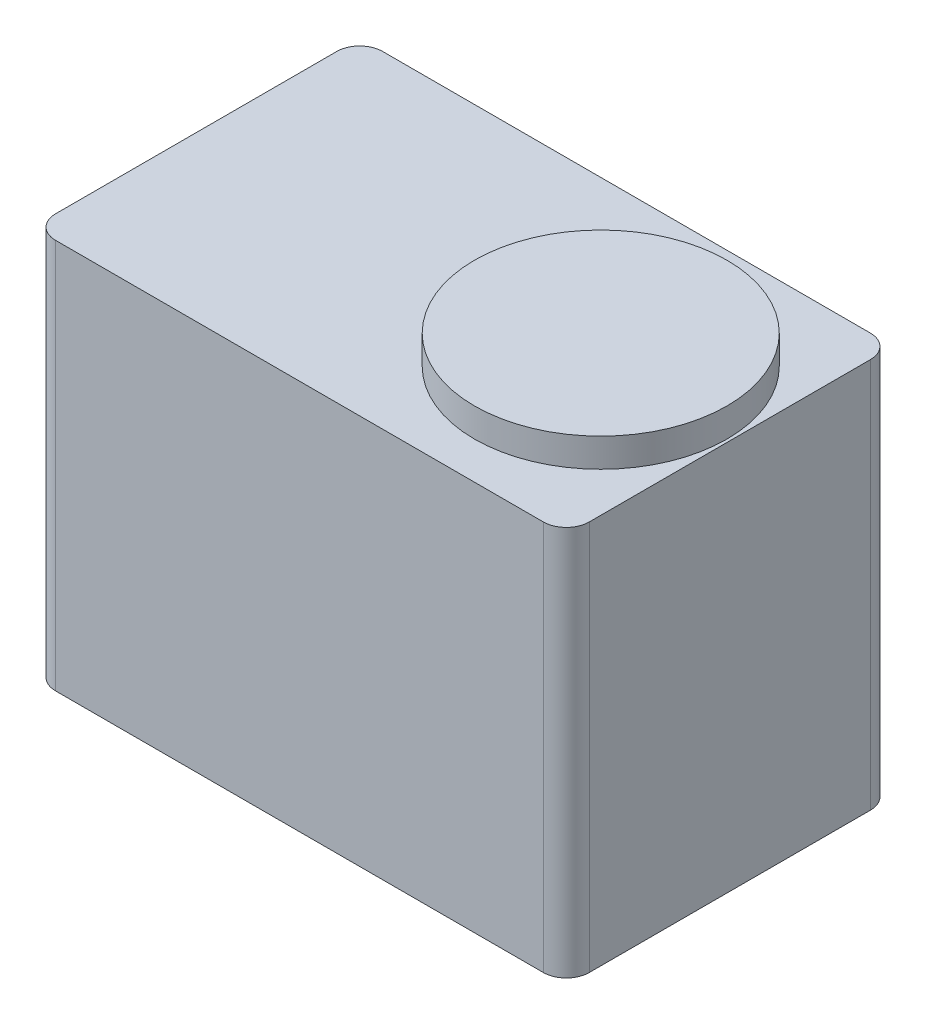
ISO-10303-21;
HEADER;
FILE_DESCRIPTION(('STEP AP214'),'2;1');
FILE_NAME('part.step','',(''),(''),'','','');
FILE_SCHEMA(('AUTOMOTIVE_DESIGN { 1 0 10303 214 1 1 1 1 }'));
ENDSEC;
DATA;
#1=APPLICATION_CONTEXT('core data for automotive mechanical design processes');
#2=APPLICATION_PROTOCOL_DEFINITION('international standard','automotive_design',2000,#1);
#3=PRODUCT_CONTEXT('',#1,'mechanical');
#4=PRODUCT('Part','Part','',(#3));
#5=PRODUCT_RELATED_PRODUCT_CATEGORY('part','',(#4));
#6=PRODUCT_DEFINITION_FORMATION('','',#4);
#7=PRODUCT_DEFINITION_CONTEXT('part definition',#1,'design');
#8=PRODUCT_DEFINITION('design','',#6,#7);
#9=PRODUCT_DEFINITION_SHAPE('','',#8);
#10=(LENGTH_UNIT() NAMED_UNIT(*) SI_UNIT(.MILLI.,.METRE.));
#11=(NAMED_UNIT(*) PLANE_ANGLE_UNIT() SI_UNIT($,.RADIAN.));
#12=(NAMED_UNIT(*) SI_UNIT($,.STERADIAN.) SOLID_ANGLE_UNIT());
#13=UNCERTAINTY_MEASURE_WITH_UNIT(LENGTH_MEASURE(1.E-05),#10,'distance_accuracy_value','');
#14=(GEOMETRIC_REPRESENTATION_CONTEXT(3) GLOBAL_UNCERTAINTY_ASSIGNED_CONTEXT((#13)) GLOBAL_UNIT_ASSIGNED_CONTEXT((#10,
#11,#12)) REPRESENTATION_CONTEXT('',''));
#15=CARTESIAN_POINT('',(0.,0.,0.));
#16=DIRECTION('',(0.,0.,1.));
#17=DIRECTION('',(1.,0.,0.));
#18=AXIS2_PLACEMENT_3D('',#15,#16,#17);
#19=CARTESIAN_POINT('',(21.25,17.,12.25));
#20=DIRECTION('',(0.,-1.,0.));
#21=DIRECTION('',(0.,0.,-1.));
#22=AXIS2_PLACEMENT_3D('',#19,#20,#21);
#23=CYLINDRICAL_SURFACE('',#22,2.);
#24=CARTESIAN_POINT('',(21.25,-17.,12.25));
#25=DIRECTION('',(0.,1.,0.));
#26=DIRECTION('',(0.,0.,1.));
#27=AXIS2_PLACEMENT_3D('',#24,#25,#26);
#28=CIRCLE('',#27,2.);
#29=CARTESIAN_POINT('',(21.25,-17.,14.25));
#30=VERTEX_POINT('',#29);
#31=CARTESIAN_POINT('',(23.25,-17.,12.25));
#32=VERTEX_POINT('',#31);
#33=EDGE_CURVE('E141',#30,#32,#28,.T.);
#34=ORIENTED_EDGE('',*,*,#33,.T.);
#35=DIRECTION('',(0.,-1.,0.));
#36=VECTOR('',#35,1.);
#37=CARTESIAN_POINT('',(23.25,17.,12.25));
#38=LINE('',#37,#36);
#39=CARTESIAN_POINT('',(23.25,17.,12.25));
#40=VERTEX_POINT('',#39);
#41=EDGE_CURVE('E46',#40,#32,#38,.T.);
#42=ORIENTED_EDGE('',*,*,#41,.F.);
#43=CARTESIAN_POINT('',(21.25,17.,12.25));
#44=DIRECTION('',(0.,1.,0.));
#45=DIRECTION('',(0.,0.,1.));
#46=AXIS2_PLACEMENT_3D('',#43,#44,#45);
#47=CIRCLE('',#46,2.);
#48=CARTESIAN_POINT('',(21.25,17.,14.25));
#49=VERTEX_POINT('',#48);
#50=EDGE_CURVE('E156',#49,#40,#47,.T.);
#51=ORIENTED_EDGE('',*,*,#50,.F.);
#52=DIRECTION('',(0.,-1.,0.));
#53=VECTOR('',#52,1.);
#54=CARTESIAN_POINT('',(21.25,17.,14.25));
#55=LINE('',#54,#53);
#56=EDGE_CURVE('E137',#49,#30,#55,.T.);
#57=ORIENTED_EDGE('',*,*,#56,.T.);
#58=EDGE_LOOP('',(#34,#42,#51,#57));
#59=FACE_BOUND('',#58,.T.);
#60=ADVANCED_FACE('F43',(#59),#23,.T.);
#61=CARTESIAN_POINT('',(23.25,17.,12.25));
#62=DIRECTION('',(-1.,0.,0.));
#63=DIRECTION('',(0.,0.,1.));
#64=AXIS2_PLACEMENT_3D('',#61,#62,#63);
#65=PLANE('',#64);
#66=DIRECTION('',(0.,0.,-1.));
#67=VECTOR('',#66,1.);
#68=CARTESIAN_POINT('',(23.25,-17.,12.25));
#69=LINE('',#68,#67);
#70=CARTESIAN_POINT('',(23.25,-17.,-12.25));
#71=VERTEX_POINT('',#70);
#72=EDGE_CURVE('E144',#32,#71,#69,.T.);
#73=ORIENTED_EDGE('',*,*,#72,.T.);
#74=DIRECTION('',(0.,-1.,0.));
#75=VECTOR('',#74,1.);
#76=CARTESIAN_POINT('',(23.25,17.,-12.25));
#77=LINE('',#76,#75);
#78=CARTESIAN_POINT('',(23.25,17.,-12.25));
#79=VERTEX_POINT('',#78);
#80=EDGE_CURVE('E165',#79,#71,#77,.T.);
#81=ORIENTED_EDGE('',*,*,#80,.F.);
#82=DIRECTION('',(0.,0.,-1.));
#83=VECTOR('',#82,1.);
#84=CARTESIAN_POINT('',(23.25,17.,12.25));
#85=LINE('',#84,#83);
#86=EDGE_CURVE('E104',#40,#79,#85,.T.);
#87=ORIENTED_EDGE('',*,*,#86,.F.);
#88=ORIENTED_EDGE('',*,*,#41,.T.);
#89=EDGE_LOOP('',(#73,#81,#87,#88));
#90=FACE_BOUND('',#89,.T.);
#91=ADVANCED_FACE('F171',(#90),#65,.F.);
#92=CARTESIAN_POINT('',(21.25,17.,-12.25));
#93=DIRECTION('',(0.,-1.,0.));
#94=DIRECTION('',(0.,0.,-1.));
#95=AXIS2_PLACEMENT_3D('',#92,#93,#94);
#96=CYLINDRICAL_SURFACE('',#95,2.);
#97=CARTESIAN_POINT('',(21.25,-17.,-12.25));
#98=DIRECTION('',(0.,1.,0.));
#99=DIRECTION('',(0.,0.,-1.));
#100=AXIS2_PLACEMENT_3D('',#97,#98,#99);
#101=CIRCLE('',#100,2.);
#102=CARTESIAN_POINT('',(21.25,-17.,-14.25));
#103=VERTEX_POINT('',#102);
#104=EDGE_CURVE('E147',#71,#103,#101,.T.);
#105=ORIENTED_EDGE('',*,*,#104,.T.);
#106=DIRECTION('',(0.,-1.,0.));
#107=VECTOR('',#106,1.);
#108=CARTESIAN_POINT('',(21.25,17.,-14.25));
#109=LINE('',#108,#107);
#110=CARTESIAN_POINT('',(21.25,17.,-14.25));
#111=VERTEX_POINT('',#110);
#112=EDGE_CURVE('E163',#111,#103,#109,.T.);
#113=ORIENTED_EDGE('',*,*,#112,.F.);
#114=CARTESIAN_POINT('',(21.25,17.,-12.25));
#115=DIRECTION('',(0.,1.,0.));
#116=DIRECTION('',(0.,0.,-1.));
#117=AXIS2_PLACEMENT_3D('',#114,#115,#116);
#118=CIRCLE('',#117,2.);
#119=EDGE_CURVE('E186',#79,#111,#118,.T.);
#120=ORIENTED_EDGE('',*,*,#119,.F.);
#121=ORIENTED_EDGE('',*,*,#80,.T.);
#122=EDGE_LOOP('',(#105,#113,#120,#121));
#123=FACE_BOUND('',#122,.T.);
#124=ADVANCED_FACE('F180',(#123),#96,.T.);
#125=CARTESIAN_POINT('',(-21.25,17.,-14.25));
#126=DIRECTION('',(0.,0.,1.));
#127=DIRECTION('',(1.,0.,0.));
#128=AXIS2_PLACEMENT_3D('',#125,#126,#127);
#129=PLANE('',#128);
#130=DIRECTION('',(-1.,0.,0.));
#131=VECTOR('',#130,1.);
#132=CARTESIAN_POINT('',(-21.25,-17.,-14.25));
#133=LINE('',#132,#131);
#134=CARTESIAN_POINT('',(-21.25,-17.,-14.25));
#135=VERTEX_POINT('',#134);
#136=EDGE_CURVE('E149',#103,#135,#133,.T.);
#137=ORIENTED_EDGE('',*,*,#136,.T.);
#138=DIRECTION('',(0.,-1.,0.));
#139=VECTOR('',#138,1.);
#140=CARTESIAN_POINT('',(-21.25,17.,-14.25));
#141=LINE('',#140,#139);
#142=CARTESIAN_POINT('',(-21.25,17.,-14.25));
#143=VERTEX_POINT('',#142);
#144=EDGE_CURVE('E160',#143,#135,#141,.T.);
#145=ORIENTED_EDGE('',*,*,#144,.F.);
#146=DIRECTION('',(-1.,0.,0.));
#147=VECTOR('',#146,1.);
#148=CARTESIAN_POINT('',(-21.25,17.,-14.25));
#149=LINE('',#148,#147);
#150=EDGE_CURVE('E185',#111,#143,#149,.T.);
#151=ORIENTED_EDGE('',*,*,#150,.F.);
#152=ORIENTED_EDGE('',*,*,#112,.T.);
#153=EDGE_LOOP('',(#137,#145,#151,#152));
#154=FACE_BOUND('',#153,.T.);
#155=ADVANCED_FACE('F183',(#154),#129,.F.);
#156=CARTESIAN_POINT('',(-21.25,17.,-12.25));
#157=DIRECTION('',(0.,-1.,0.));
#158=DIRECTION('',(0.,0.,-1.));
#159=AXIS2_PLACEMENT_3D('',#156,#157,#158);
#160=CYLINDRICAL_SURFACE('',#159,2.);
#161=CARTESIAN_POINT('',(-21.25,-17.,-12.25));
#162=DIRECTION('',(0.,1.,0.));
#163=DIRECTION('',(0.,0.,-1.));
#164=AXIS2_PLACEMENT_3D('',#161,#162,#163);
#165=CIRCLE('',#164,2.);
#166=CARTESIAN_POINT('',(-23.25,-17.,-12.25));
#167=VERTEX_POINT('',#166);
#168=EDGE_CURVE('E151',#135,#167,#165,.T.);
#169=ORIENTED_EDGE('',*,*,#168,.T.);
#170=DIRECTION('',(0.,-1.,0.));
#171=VECTOR('',#170,1.);
#172=CARTESIAN_POINT('',(-23.25,17.,-12.25));
#173=LINE('',#172,#171);
#174=CARTESIAN_POINT('',(-23.25,17.,-12.25));
#175=VERTEX_POINT('',#174);
#176=EDGE_CURVE('E132',#175,#167,#173,.T.);
#177=ORIENTED_EDGE('',*,*,#176,.F.);
#178=CARTESIAN_POINT('',(-21.25,17.,-12.25));
#179=DIRECTION('',(0.,1.,0.));
#180=DIRECTION('',(0.,0.,-1.));
#181=AXIS2_PLACEMENT_3D('',#178,#179,#180);
#182=CIRCLE('',#181,2.);
#183=EDGE_CURVE('E123',#143,#175,#182,.T.);
#184=ORIENTED_EDGE('',*,*,#183,.F.);
#185=ORIENTED_EDGE('',*,*,#144,.T.);
#186=EDGE_LOOP('',(#169,#177,#184,#185));
#187=FACE_BOUND('',#186,.T.);
#188=ADVANCED_FACE('F225',(#187),#160,.T.);
#189=CARTESIAN_POINT('',(-23.25,17.,12.25));
#190=DIRECTION('',(1.,0.,0.));
#191=DIRECTION('',(0.,0.,-1.));
#192=AXIS2_PLACEMENT_3D('',#189,#190,#191);
#193=PLANE('',#192);
#194=DIRECTION('',(0.,0.,1.));
#195=VECTOR('',#194,1.);
#196=CARTESIAN_POINT('',(-23.25,-17.,12.25));
#197=LINE('',#196,#195);
#198=CARTESIAN_POINT('',(-23.25,-17.,12.25));
#199=VERTEX_POINT('',#198);
#200=EDGE_CURVE('E131',#167,#199,#197,.T.);
#201=ORIENTED_EDGE('',*,*,#200,.T.);
#202=DIRECTION('',(0.,-1.,0.));
#203=VECTOR('',#202,1.);
#204=CARTESIAN_POINT('',(-23.25,17.,12.25));
#205=LINE('',#204,#203);
#206=CARTESIAN_POINT('',(-23.25,17.,12.25));
#207=VERTEX_POINT('',#206);
#208=EDGE_CURVE('E128',#207,#199,#205,.T.);
#209=ORIENTED_EDGE('',*,*,#208,.F.);
#210=DIRECTION('',(0.,0.,1.));
#211=VECTOR('',#210,1.);
#212=CARTESIAN_POINT('',(-23.25,17.,12.25));
#213=LINE('',#212,#211);
#214=EDGE_CURVE('E117',#175,#207,#213,.T.);
#215=ORIENTED_EDGE('',*,*,#214,.F.);
#216=ORIENTED_EDGE('',*,*,#176,.T.);
#217=EDGE_LOOP('',(#201,#209,#215,#216));
#218=FACE_BOUND('',#217,.T.);
#219=ADVANCED_FACE('F129',(#218),#193,.F.);
#220=CARTESIAN_POINT('',(-21.25,17.,12.25));
#221=DIRECTION('',(0.,-1.,0.));
#222=DIRECTION('',(0.,0.,-1.));
#223=AXIS2_PLACEMENT_3D('',#220,#221,#222);
#224=CYLINDRICAL_SURFACE('',#223,2.);
#225=CARTESIAN_POINT('',(-21.25,-17.,12.25));
#226=DIRECTION('',(0.,1.,0.));
#227=DIRECTION('',(0.,0.,-1.));
#228=AXIS2_PLACEMENT_3D('',#225,#226,#227);
#229=CIRCLE('',#228,2.);
#230=CARTESIAN_POINT('',(-21.25,-17.,14.25));
#231=VERTEX_POINT('',#230);
#232=EDGE_CURVE('E89',#199,#231,#229,.T.);
#233=ORIENTED_EDGE('',*,*,#232,.T.);
#234=DIRECTION('',(0.,-1.,0.));
#235=VECTOR('',#234,1.);
#236=CARTESIAN_POINT('',(-21.25,17.,14.25));
#237=LINE('',#236,#235);
#238=CARTESIAN_POINT('',(-21.25,17.,14.25));
#239=VERTEX_POINT('',#238);
#240=EDGE_CURVE('E133',#239,#231,#237,.T.);
#241=ORIENTED_EDGE('',*,*,#240,.F.);
#242=CARTESIAN_POINT('',(-21.25,17.,12.25));
#243=DIRECTION('',(0.,1.,0.));
#244=DIRECTION('',(0.,0.,-1.));
#245=AXIS2_PLACEMENT_3D('',#242,#243,#244);
#246=CIRCLE('',#245,2.);
#247=EDGE_CURVE('E121',#207,#239,#246,.T.);
#248=ORIENTED_EDGE('',*,*,#247,.F.);
#249=ORIENTED_EDGE('',*,*,#208,.T.);
#250=EDGE_LOOP('',(#233,#241,#248,#249));
#251=FACE_BOUND('',#250,.T.);
#252=ADVANCED_FACE('F135',(#251),#224,.T.);
#253=CARTESIAN_POINT('',(-21.25,17.,14.25));
#254=DIRECTION('',(0.,0.,-1.));
#255=DIRECTION('',(-1.,0.,0.));
#256=AXIS2_PLACEMENT_3D('',#253,#254,#255);
#257=PLANE('',#256);
#258=DIRECTION('',(1.,0.,0.));
#259=VECTOR('',#258,1.);
#260=CARTESIAN_POINT('',(-21.25,-17.,14.25));
#261=LINE('',#260,#259);
#262=EDGE_CURVE('E95',#231,#30,#261,.T.);
#263=ORIENTED_EDGE('',*,*,#262,.T.);
#264=ORIENTED_EDGE('',*,*,#56,.F.);
#265=DIRECTION('',(1.,0.,0.));
#266=VECTOR('',#265,1.);
#267=CARTESIAN_POINT('',(-21.25,17.,14.25));
#268=LINE('',#267,#266);
#269=EDGE_CURVE('E60',#239,#49,#268,.T.);
#270=ORIENTED_EDGE('',*,*,#269,.F.);
#271=ORIENTED_EDGE('',*,*,#240,.T.);
#272=EDGE_LOOP('',(#263,#264,#270,#271));
#273=FACE_BOUND('',#272,.T.);
#274=ADVANCED_FACE('F233',(#273),#257,.F.);
#275=CARTESIAN_POINT('',(21.25,17.,12.25));
#276=DIRECTION('',(0.,1.,0.));
#277=DIRECTION('',(0.,0.,1.));
#278=AXIS2_PLACEMENT_3D('',#275,#276,#277);
#279=PLANE('',#278);
#280=CARTESIAN_POINT('',(12.,17.,0.));
#281=DIRECTION('',(0.,1.,0.));
#282=DIRECTION('',(0.,0.,1.));
#283=AXIS2_PLACEMENT_3D('',#280,#281,#282);
#284=CIRCLE('',#283,11.);
#285=CARTESIAN_POINT('',(12.,17.,11.));
#286=VERTEX_POINT('',#285);
#287=EDGE_CURVE('E11',#286,#286,#284,.T.);
#288=ORIENTED_EDGE('',*,*,#287,.F.);
#289=EDGE_LOOP('',(#288));
#290=FACE_BOUND('',#289,.T.);
#291=ORIENTED_EDGE('',*,*,#50,.T.);
#292=ORIENTED_EDGE('',*,*,#86,.T.);
#293=ORIENTED_EDGE('',*,*,#119,.T.);
#294=ORIENTED_EDGE('',*,*,#150,.T.);
#295=ORIENTED_EDGE('',*,*,#183,.T.);
#296=ORIENTED_EDGE('',*,*,#214,.T.);
#297=ORIENTED_EDGE('',*,*,#247,.T.);
#298=ORIENTED_EDGE('',*,*,#269,.T.);
#299=EDGE_LOOP('',(#291,#292,#293,#294,#295,#296,#297,#298));
#300=FACE_BOUND('',#299,.T.);
#301=ADVANCED_FACE('F119',(#290,#300),#279,.T.);
#302=CARTESIAN_POINT('',(21.25,-17.,12.25));
#303=DIRECTION('',(0.,1.,0.));
#304=DIRECTION('',(0.,0.,1.));
#305=AXIS2_PLACEMENT_3D('',#302,#303,#304);
#306=PLANE('',#305);
#307=CARTESIAN_POINT('',(12.,-17.,0.));
#308=DIRECTION('',(0.,1.,0.));
#309=DIRECTION('',(0.,0.,1.));
#310=AXIS2_PLACEMENT_3D('',#307,#308,#309);
#311=CIRCLE('',#310,7.);
#312=CARTESIAN_POINT('',(12.,-17.,7.));
#313=VERTEX_POINT('',#312);
#314=EDGE_CURVE('E194',#313,#313,#311,.T.);
#315=ORIENTED_EDGE('',*,*,#314,.T.);
#316=EDGE_LOOP('',(#315));
#317=FACE_BOUND('',#316,.T.);
#318=ORIENTED_EDGE('',*,*,#33,.F.);
#319=ORIENTED_EDGE('',*,*,#262,.F.);
#320=ORIENTED_EDGE('',*,*,#232,.F.);
#321=ORIENTED_EDGE('',*,*,#200,.F.);
#322=ORIENTED_EDGE('',*,*,#168,.F.);
#323=ORIENTED_EDGE('',*,*,#136,.F.);
#324=ORIENTED_EDGE('',*,*,#104,.F.);
#325=ORIENTED_EDGE('',*,*,#72,.F.);
#326=EDGE_LOOP('',(#318,#319,#320,#321,#322,#323,#324,#325));
#327=FACE_BOUND('',#326,.T.);
#328=ADVANCED_FACE('F176',(#317,#327),#306,.F.);
#329=CARTESIAN_POINT('',(12.,19.5,0.));
#330=DIRECTION('',(0.,-1.,0.));
#331=DIRECTION('',(0.,0.,-1.));
#332=AXIS2_PLACEMENT_3D('',#329,#330,#331);
#333=CYLINDRICAL_SURFACE('',#332,11.);
#334=CARTESIAN_POINT('',(12.,19.5,0.));
#335=DIRECTION('',(0.,1.,0.));
#336=DIRECTION('',(0.,0.,1.));
#337=AXIS2_PLACEMENT_3D('',#334,#335,#336);
#338=CIRCLE('',#337,11.);
#339=CARTESIAN_POINT('',(12.,19.5,11.));
#340=VERTEX_POINT('',#339);
#341=EDGE_CURVE('E145',#340,#340,#338,.T.);
#342=ORIENTED_EDGE('',*,*,#341,.F.);
#343=EDGE_LOOP('',(#342));
#344=FACE_BOUND('',#343,.T.);
#345=ORIENTED_EDGE('',*,*,#287,.T.);
#346=EDGE_LOOP('',(#345));
#347=FACE_BOUND('',#346,.T.);
#348=ADVANCED_FACE('F238',(#344,#347),#333,.T.);
#349=CARTESIAN_POINT('',(12.,19.5,0.));
#350=DIRECTION('',(0.,1.,0.));
#351=DIRECTION('',(0.,0.,1.));
#352=AXIS2_PLACEMENT_3D('',#349,#350,#351);
#353=PLANE('',#352);
#354=ORIENTED_EDGE('',*,*,#341,.T.);
#355=EDGE_LOOP('',(#354));
#356=FACE_BOUND('',#355,.T.);
#357=ADVANCED_FACE('F206',(#356),#353,.T.);
#358=CARTESIAN_POINT('',(12.,-17.,0.));
#359=DIRECTION('',(0.,-1.,0.));
#360=DIRECTION('',(0.,0.,-1.));
#361=AXIS2_PLACEMENT_3D('',#358,#359,#360);
#362=CYLINDRICAL_SURFACE('',#361,7.);
#363=ORIENTED_EDGE('',*,*,#314,.F.);
#364=EDGE_LOOP('',(#363));
#365=FACE_BOUND('',#364,.T.);
#366=CARTESIAN_POINT('',(12.,-18.5,0.));
#367=DIRECTION('',(0.,1.,0.));
#368=DIRECTION('',(0.,0.,1.));
#369=AXIS2_PLACEMENT_3D('',#366,#367,#368);
#370=CIRCLE('',#369,7.);
#371=CARTESIAN_POINT('',(12.,-18.5,7.));
#372=VERTEX_POINT('',#371);
#373=EDGE_CURVE('E195',#372,#372,#370,.T.);
#374=ORIENTED_EDGE('',*,*,#373,.T.);
#375=EDGE_LOOP('',(#374));
#376=FACE_BOUND('',#375,.T.);
#377=ADVANCED_FACE('F202',(#365,#376),#362,.T.);
#378=CARTESIAN_POINT('',(12.,-18.5,0.));
#379=DIRECTION('',(0.,1.,0.));
#380=DIRECTION('',(0.,0.,1.));
#381=AXIS2_PLACEMENT_3D('',#378,#379,#380);
#382=PLANE('',#381);
#383=ORIENTED_EDGE('',*,*,#373,.F.);
#384=EDGE_LOOP('',(#383));
#385=FACE_BOUND('',#384,.T.);
#386=ADVANCED_FACE('F205',(#385),#382,.F.);
#387=CLOSED_SHELL('',(#60,#91,#124,#155,#188,#219,#252,#274,#301,#328,#348,#357,#377,#386));
#388=MANIFOLD_SOLID_BREP('B2',#387);
#389=ADVANCED_BREP_SHAPE_REPRESENTATION('',(#18,#388),#14);
#390=SHAPE_DEFINITION_REPRESENTATION(#9,#389);
ENDSEC;
END-ISO-10303-21;
